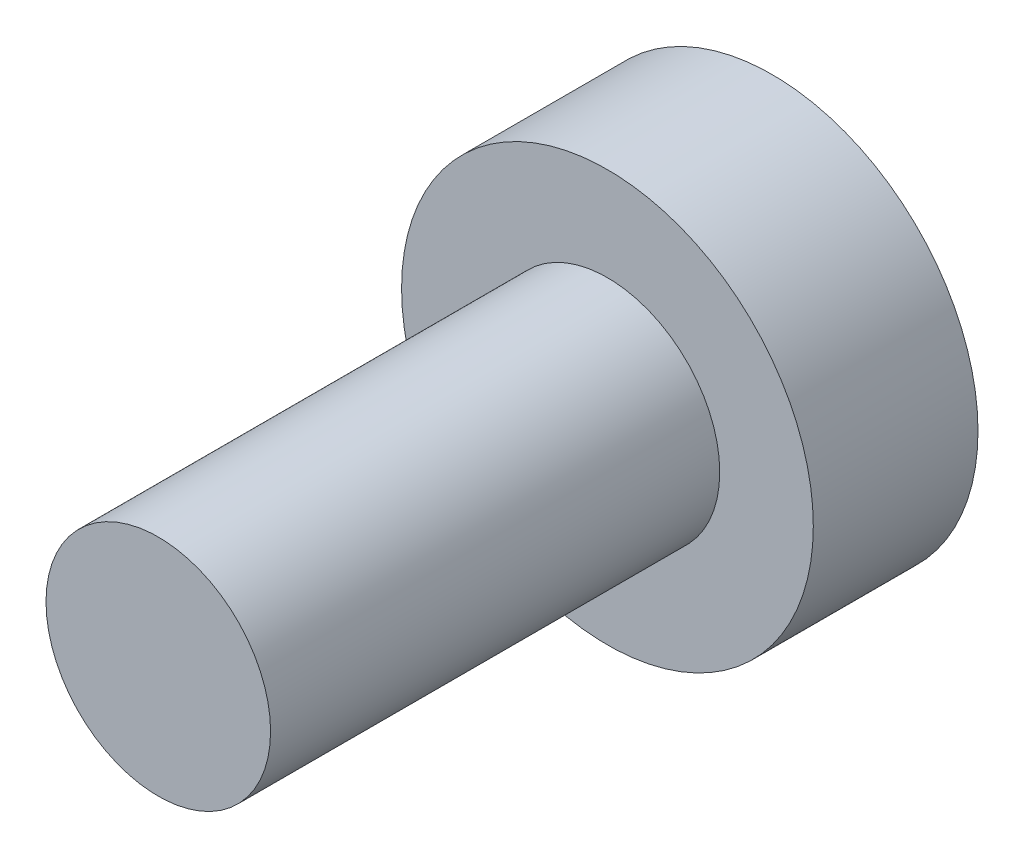
ISO-10303-21;
HEADER;
FILE_DESCRIPTION(('STEP AP214'),'2;1');
FILE_NAME('part.step','',(''),(''),'','','');
FILE_SCHEMA(('AUTOMOTIVE_DESIGN { 1 0 10303 214 1 1 1 1 }'));
ENDSEC;
DATA;
#1=APPLICATION_CONTEXT('core data for automotive mechanical design processes');
#2=APPLICATION_PROTOCOL_DEFINITION('international standard','automotive_design',2000,#1);
#3=PRODUCT_CONTEXT('',#1,'mechanical');
#4=PRODUCT('Part','Part','',(#3));
#5=PRODUCT_RELATED_PRODUCT_CATEGORY('part','',(#4));
#6=PRODUCT_DEFINITION_FORMATION('','',#4);
#7=PRODUCT_DEFINITION_CONTEXT('part definition',#1,'design');
#8=PRODUCT_DEFINITION('design','',#6,#7);
#9=PRODUCT_DEFINITION_SHAPE('','',#8);
#10=(LENGTH_UNIT() NAMED_UNIT(*) SI_UNIT(.MILLI.,.METRE.));
#11=(NAMED_UNIT(*) PLANE_ANGLE_UNIT() SI_UNIT($,.RADIAN.));
#12=(NAMED_UNIT(*) SI_UNIT($,.STERADIAN.) SOLID_ANGLE_UNIT());
#13=UNCERTAINTY_MEASURE_WITH_UNIT(LENGTH_MEASURE(1.E-05),#10,'distance_accuracy_value','');
#14=(GEOMETRIC_REPRESENTATION_CONTEXT(3) GLOBAL_UNCERTAINTY_ASSIGNED_CONTEXT((#13)) GLOBAL_UNIT_ASSIGNED_CONTEXT((#10,
#11,#12)) REPRESENTATION_CONTEXT('',''));
#15=CARTESIAN_POINT('',(0.,0.,0.));
#16=DIRECTION('',(0.,0.,1.));
#17=DIRECTION('',(1.,0.,0.));
#18=AXIS2_PLACEMENT_3D('',#15,#16,#17);
#19=CARTESIAN_POINT('',(0.,0.,2.2));
#20=DIRECTION('',(0.,0.,-1.));
#21=DIRECTION('',(-1.,0.,0.));
#22=AXIS2_PLACEMENT_3D('',#19,#20,#21);
#23=CYLINDRICAL_SURFACE('',#22,2.75);
#24=CARTESIAN_POINT('',(0.,0.,2.2));
#25=DIRECTION('',(0.,0.,1.));
#26=DIRECTION('',(1.,0.,0.));
#27=AXIS2_PLACEMENT_3D('',#24,#25,#26);
#28=CIRCLE('',#27,2.75);
#29=CARTESIAN_POINT('',(2.75,0.,2.2));
#30=VERTEX_POINT('',#29);
#31=EDGE_CURVE('E39',#30,#30,#28,.T.);
#32=ORIENTED_EDGE('',*,*,#31,.F.);
#33=EDGE_LOOP('',(#32));
#34=FACE_BOUND('',#33,.T.);
#35=CARTESIAN_POINT('',(0.,0.,0.));
#36=DIRECTION('',(0.,0.,1.));
#37=DIRECTION('',(1.,0.,0.));
#38=AXIS2_PLACEMENT_3D('',#35,#36,#37);
#39=CIRCLE('',#38,2.75);
#40=CARTESIAN_POINT('',(2.75,0.,0.));
#41=VERTEX_POINT('',#40);
#42=EDGE_CURVE('E35',#41,#41,#39,.T.);
#43=ORIENTED_EDGE('',*,*,#42,.T.);
#44=EDGE_LOOP('',(#43));
#45=FACE_BOUND('',#44,.T.);
#46=ADVANCED_FACE('F32',(#34,#45),#23,.T.);
#47=CARTESIAN_POINT('',(0.,0.,2.2));
#48=DIRECTION('',(0.,0.,1.));
#49=DIRECTION('',(1.,0.,0.));
#50=AXIS2_PLACEMENT_3D('',#47,#48,#49);
#51=PLANE('',#50);
#52=CARTESIAN_POINT('',(0.,0.,2.2));
#53=DIRECTION('',(0.,0.,1.));
#54=DIRECTION('',(1.,0.,0.));
#55=AXIS2_PLACEMENT_3D('',#52,#53,#54);
#56=CIRCLE('',#55,1.5);
#57=CARTESIAN_POINT('',(1.5,0.,2.2));
#58=VERTEX_POINT('',#57);
#59=EDGE_CURVE('E10',#58,#58,#56,.T.);
#60=ORIENTED_EDGE('',*,*,#59,.F.);
#61=EDGE_LOOP('',(#60));
#62=FACE_BOUND('',#61,.T.);
#63=ORIENTED_EDGE('',*,*,#31,.T.);
#64=EDGE_LOOP('',(#63));
#65=FACE_BOUND('',#64,.T.);
#66=ADVANCED_FACE('F56',(#62,#65),#51,.T.);
#67=CARTESIAN_POINT('',(0.,0.,0.));
#68=DIRECTION('',(0.,0.,1.));
#69=DIRECTION('',(1.,0.,0.));
#70=AXIS2_PLACEMENT_3D('',#67,#68,#69);
#71=PLANE('',#70);
#72=ORIENTED_EDGE('',*,*,#42,.F.);
#73=EDGE_LOOP('',(#72));
#74=FACE_BOUND('',#73,.T.);
#75=ADVANCED_FACE('F53',(#74),#71,.F.);
#76=CARTESIAN_POINT('',(0.,0.,8.2));
#77=DIRECTION('',(0.,0.,-1.));
#78=DIRECTION('',(-1.,0.,0.));
#79=AXIS2_PLACEMENT_3D('',#76,#77,#78);
#80=CYLINDRICAL_SURFACE('',#79,1.5);
#81=CARTESIAN_POINT('',(0.,0.,8.2));
#82=DIRECTION('',(0.,0.,1.));
#83=DIRECTION('',(1.,0.,0.));
#84=AXIS2_PLACEMENT_3D('',#81,#82,#83);
#85=CIRCLE('',#84,1.5);
#86=CARTESIAN_POINT('',(1.5,0.,8.2));
#87=VERTEX_POINT('',#86);
#88=EDGE_CURVE('E45',#87,#87,#85,.T.);
#89=ORIENTED_EDGE('',*,*,#88,.F.);
#90=EDGE_LOOP('',(#89));
#91=FACE_BOUND('',#90,.T.);
#92=ORIENTED_EDGE('',*,*,#59,.T.);
#93=EDGE_LOOP('',(#92));
#94=FACE_BOUND('',#93,.T.);
#95=ADVANCED_FACE('F55',(#91,#94),#80,.T.);
#96=CARTESIAN_POINT('',(0.,0.,8.2));
#97=DIRECTION('',(0.,0.,1.));
#98=DIRECTION('',(1.,0.,0.));
#99=AXIS2_PLACEMENT_3D('',#96,#97,#98);
#100=PLANE('',#99);
#101=ORIENTED_EDGE('',*,*,#88,.T.);
#102=EDGE_LOOP('',(#101));
#103=FACE_BOUND('',#102,.T.);
#104=ADVANCED_FACE('F61',(#103),#100,.T.);
#105=CLOSED_SHELL('',(#46,#66,#75,#95,#104));
#106=MANIFOLD_SOLID_BREP('B2',#105);
#107=ADVANCED_BREP_SHAPE_REPRESENTATION('',(#18,#106),#14);
#108=SHAPE_DEFINITION_REPRESENTATION(#9,#107);
ENDSEC;
END-ISO-10303-21;
